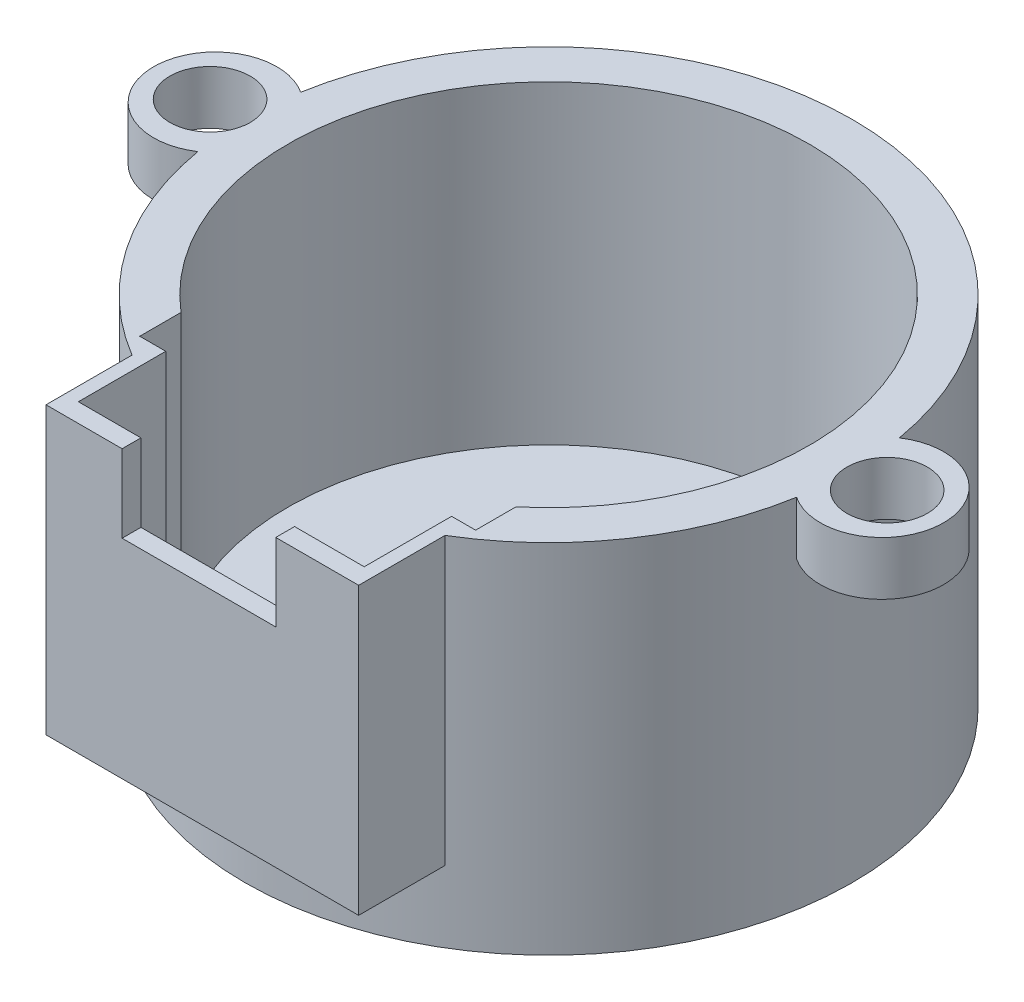
ISO-10303-21;
HEADER;
FILE_DESCRIPTION(('STEP AP214'),'2;1');
FILE_NAME('part.step','',(''),(''),'','','');
FILE_SCHEMA(('AUTOMOTIVE_DESIGN { 1 0 10303 214 1 1 1 1 }'));
ENDSEC;
DATA;
#1=APPLICATION_CONTEXT('core data for automotive mechanical design processes');
#2=APPLICATION_PROTOCOL_DEFINITION('international standard','automotive_design',2000,#1);
#3=PRODUCT_CONTEXT('',#1,'mechanical');
#4=PRODUCT('Part','Part','',(#3));
#5=PRODUCT_RELATED_PRODUCT_CATEGORY('part','',(#4));
#6=PRODUCT_DEFINITION_FORMATION('','',#4);
#7=PRODUCT_DEFINITION_CONTEXT('part definition',#1,'design');
#8=PRODUCT_DEFINITION('design','',#6,#7);
#9=PRODUCT_DEFINITION_SHAPE('','',#8);
#10=(LENGTH_UNIT() NAMED_UNIT(*) SI_UNIT(.MILLI.,.METRE.));
#11=(NAMED_UNIT(*) PLANE_ANGLE_UNIT() SI_UNIT($,.RADIAN.));
#12=(NAMED_UNIT(*) SI_UNIT($,.STERADIAN.) SOLID_ANGLE_UNIT());
#13=UNCERTAINTY_MEASURE_WITH_UNIT(LENGTH_MEASURE(1.E-05),#10,'distance_accuracy_value','');
#14=(GEOMETRIC_REPRESENTATION_CONTEXT(3) GLOBAL_UNCERTAINTY_ASSIGNED_CONTEXT((#13)) GLOBAL_UNIT_ASSIGNED_CONTEXT((#10,
#11,#12)) REPRESENTATION_CONTEXT('',''));
#15=CARTESIAN_POINT('',(0.,0.,0.));
#16=DIRECTION('',(0.,0.,1.));
#17=DIRECTION('',(1.,0.,0.));
#18=AXIS2_PLACEMENT_3D('',#15,#16,#17);
#19=CARTESIAN_POINT('',(0.,20.,0.));
#20=DIRECTION('',(0.,-1.,0.));
#21=DIRECTION('',(0.,0.,-1.));
#22=AXIS2_PLACEMENT_3D('',#19,#20,#21);
#23=CYLINDRICAL_SURFACE('',#22,17.);
#24=CARTESIAN_POINT('',(0.,4.,0.));
#25=DIRECTION('',(0.,1.,0.));
#26=DIRECTION('',(0.,0.,1.));
#27=AXIS2_PLACEMENT_3D('',#24,#25,#26);
#28=CIRCLE('',#27,17.);
#29=CARTESIAN_POINT('',(-8.7324203202721,4.,14.5857751028219));
#30=VERTEX_POINT('',#29);
#31=CARTESIAN_POINT('',(8.76757967972789,4.,14.5646677462832));
#32=VERTEX_POINT('',#31);
#33=EDGE_CURVE('E318',#30,#32,#28,.T.);
#34=ORIENTED_EDGE('',*,*,#33,.F.);
#35=DIRECTION('',(0.,-1.,0.));
#36=VECTOR('',#35,1.);
#37=CARTESIAN_POINT('',(-8.73242032027211,20.,14.5857751028219));
#38=LINE('',#37,#36);
#39=CARTESIAN_POINT('',(-8.73242032027211,20.,14.5857751028219));
#40=VERTEX_POINT('',#39);
#41=EDGE_CURVE('E399',#30,#40,#38,.F.);
#42=ORIENTED_EDGE('',*,*,#41,.T.);
#43=CARTESIAN_POINT('',(0.,20.,0.));
#44=DIRECTION('',(0.,1.,0.));
#45=DIRECTION('',(0.,0.,1.));
#46=AXIS2_PLACEMENT_3D('',#43,#44,#45);
#47=CIRCLE('',#46,17.);
#48=CARTESIAN_POINT('',(-16.7548421095073,20.,2.87667618710923));
#49=VERTEX_POINT('',#48);
#50=EDGE_CURVE('E254',#49,#40,#47,.T.);
#51=ORIENTED_EDGE('',*,*,#50,.F.);
#52=DIRECTION('',(0.,1.,0.));
#53=VECTOR('',#52,1.);
#54=CARTESIAN_POINT('',(-16.7548421095073,18.5,2.87667618710924));
#55=LINE('',#54,#53);
#56=CARTESIAN_POINT('',(-16.7548421095073,17.,2.87667618710924));
#57=VERTEX_POINT('',#56);
#58=EDGE_CURVE('E430',#49,#57,#55,.F.);
#59=ORIENTED_EDGE('',*,*,#58,.T.);
#60=CARTESIAN_POINT('',(0.,17.,0.));
#61=DIRECTION('',(0.,-1.,0.));
#62=DIRECTION('',(0.,0.,-1.));
#63=AXIS2_PLACEMENT_3D('',#60,#61,#62);
#64=CIRCLE('',#63,17.);
#65=CARTESIAN_POINT('',(-16.9667546174142,17.,1.06265598970331));
#66=VERTEX_POINT('',#65);
#67=EDGE_CURVE('E259',#57,#66,#64,.T.);
#68=ORIENTED_EDGE('',*,*,#67,.T.);
#69=CARTESIAN_POINT('',(-16.9667546174143,17.,-1.06265598970331));
#70=VERTEX_POINT('',#69);
#71=EDGE_CURVE('E263',#66,#70,#64,.T.);
#72=ORIENTED_EDGE('',*,*,#71,.T.);
#73=CARTESIAN_POINT('',(-16.7548421095073,17.,-2.87667618710924));
#74=VERTEX_POINT('',#73);
#75=EDGE_CURVE('E256',#70,#74,#64,.T.);
#76=ORIENTED_EDGE('',*,*,#75,.T.);
#77=DIRECTION('',(0.,1.,0.));
#78=VECTOR('',#77,1.);
#79=CARTESIAN_POINT('',(-16.7548421095073,18.5,-2.87667618710924));
#80=LINE('',#79,#78);
#81=CARTESIAN_POINT('',(-16.7548421095073,20.,-2.87667618710924));
#82=VERTEX_POINT('',#81);
#83=EDGE_CURVE('E250',#74,#82,#80,.T.);
#84=ORIENTED_EDGE('',*,*,#83,.T.);
#85=CARTESIAN_POINT('',(16.7548421095073,20.,-2.87667618710923));
#86=VERTEX_POINT('',#85);
#87=EDGE_CURVE('E247',#86,#82,#47,.T.);
#88=ORIENTED_EDGE('',*,*,#87,.F.);
#89=DIRECTION('',(0.,1.,0.));
#90=VECTOR('',#89,1.);
#91=CARTESIAN_POINT('',(16.7548421095073,18.5,-2.87667618710924));
#92=LINE('',#91,#90);
#93=CARTESIAN_POINT('',(16.7548421095073,17.,-2.87667618710924));
#94=VERTEX_POINT('',#93);
#95=EDGE_CURVE('E419',#86,#94,#92,.F.);
#96=ORIENTED_EDGE('',*,*,#95,.T.);
#97=CARTESIAN_POINT('',(0.,17.,0.));
#98=DIRECTION('',(0.,1.,0.));
#99=DIRECTION('',(0.,0.,1.));
#100=AXIS2_PLACEMENT_3D('',#97,#98,#99);
#101=CIRCLE('',#100,17.);
#102=CARTESIAN_POINT('',(16.9667546174142,17.,-1.06265598970332));
#103=VERTEX_POINT('',#102);
#104=EDGE_CURVE('E262',#103,#94,#101,.T.);
#105=ORIENTED_EDGE('',*,*,#104,.F.);
#106=CARTESIAN_POINT('',(16.9667546174143,17.,1.0626559897033));
#107=VERTEX_POINT('',#106);
#108=EDGE_CURVE('E268',#107,#103,#101,.T.);
#109=ORIENTED_EDGE('',*,*,#108,.F.);
#110=CARTESIAN_POINT('',(16.7548421095073,17.,2.87667618710924));
#111=VERTEX_POINT('',#110);
#112=EDGE_CURVE('E264',#111,#107,#101,.T.);
#113=ORIENTED_EDGE('',*,*,#112,.F.);
#114=DIRECTION('',(0.,1.,0.));
#115=VECTOR('',#114,1.);
#116=CARTESIAN_POINT('',(16.7548421095073,18.5,2.87667618710924));
#117=LINE('',#116,#115);
#118=CARTESIAN_POINT('',(16.7548421095073,20.,2.87667618710924));
#119=VERTEX_POINT('',#118);
#120=EDGE_CURVE('E423',#111,#119,#117,.T.);
#121=ORIENTED_EDGE('',*,*,#120,.T.);
#122=CARTESIAN_POINT('',(8.76757967972789,20.,14.5646677462832));
#123=VERTEX_POINT('',#122);
#124=EDGE_CURVE('E257',#123,#119,#47,.T.);
#125=ORIENTED_EDGE('',*,*,#124,.F.);
#126=DIRECTION('',(0.,-1.,0.));
#127=VECTOR('',#126,1.);
#128=CARTESIAN_POINT('',(8.76757967972789,20.,14.5646677462832));
#129=LINE('',#128,#127);
#130=EDGE_CURVE('E401',#123,#32,#129,.T.);
#131=ORIENTED_EDGE('',*,*,#130,.T.);
#132=EDGE_LOOP('',(#34,#42,#51,#59,#68,#72,#76,#84,#88,#96,#105,#109,#113,#121,#125,#131));
#133=FACE_BOUND('',#132,.T.);
#134=CARTESIAN_POINT('',(0.,0.,0.));
#135=DIRECTION('',(0.,1.,0.));
#136=DIRECTION('',(0.,0.,1.));
#137=AXIS2_PLACEMENT_3D('',#134,#135,#136);
#138=CIRCLE('',#137,17.);
#139=CARTESIAN_POINT('',(0.,0.,17.));
#140=VERTEX_POINT('',#139);
#141=EDGE_CURVE('E243',#140,#140,#138,.T.);
#142=ORIENTED_EDGE('',*,*,#141,.T.);
#143=EDGE_LOOP('',(#142));
#144=FACE_BOUND('',#143,.T.);
#145=ADVANCED_FACE('F37',(#133,#144),#23,.T.);
#146=CARTESIAN_POINT('',(0.,20.,0.));
#147=DIRECTION('',(0.,1.,0.));
#148=DIRECTION('',(0.,0.,1.));
#149=AXIS2_PLACEMENT_3D('',#146,#147,#148);
#150=PLANE('',#149);
#151=DIRECTION('',(0.,0.,1.));
#152=VECTOR('',#151,1.);
#153=CARTESIAN_POINT('',(-9.4317094190789,20.,13.4557980217237));
#154=LINE('',#153,#152);
#155=CARTESIAN_POINT('',(-9.4317094190789,20.,11.1446335710986));
#156=VERTEX_POINT('',#155);
#157=CARTESIAN_POINT('',(-9.4317094190789,20.,13.4557980217237));
#158=VERTEX_POINT('',#157);
#159=EDGE_CURVE('E208',#156,#158,#154,.T.);
#160=ORIENTED_EDGE('',*,*,#159,.F.);
#161=CARTESIAN_POINT('',(0.,20.,0.));
#162=DIRECTION('',(0.,1.,0.));
#163=DIRECTION('',(0.,0.,1.));
#164=AXIS2_PLACEMENT_3D('',#161,#162,#163);
#165=CIRCLE('',#164,14.6);
#166=CARTESIAN_POINT('',(9.3682905809211,20.,11.1979967668965));
#167=VERTEX_POINT('',#166);
#168=EDGE_CURVE('E238',#167,#156,#165,.T.);
#169=ORIENTED_EDGE('',*,*,#168,.F.);
#170=DIRECTION('',(0.,0.,-1.));
#171=VECTOR('',#170,1.);
#172=CARTESIAN_POINT('',(9.3682905809211,20.,13.4557980217237));
#173=LINE('',#172,#171);
#174=CARTESIAN_POINT('',(9.3682905809211,20.,13.4557980217237));
#175=VERTEX_POINT('',#174);
#176=EDGE_CURVE('E202',#175,#167,#173,.T.);
#177=ORIENTED_EDGE('',*,*,#176,.F.);
#178=DIRECTION('',(1.,0.,0.));
#179=VECTOR('',#178,1.);
#180=CARTESIAN_POINT('',(-9.4317094190789,20.,13.4557980217237));
#181=LINE('',#180,#179);
#182=CARTESIAN_POINT('',(8.02597753464213,20.,13.4557980217237));
#183=VERTEX_POINT('',#182);
#184=EDGE_CURVE('E227',#183,#175,#181,.T.);
#185=ORIENTED_EDGE('',*,*,#184,.F.);
#186=DIRECTION('',(0.,0.,-1.));
#187=VECTOR('',#186,1.);
#188=CARTESIAN_POINT('',(8.02597753464213,20.,18.3476478252229));
#189=LINE('',#188,#187);
#190=CARTESIAN_POINT('',(8.02597753464213,20.,18.3476478252229));
#191=VERTEX_POINT('',#190);
#192=EDGE_CURVE('E474',#191,#183,#189,.T.);
#193=ORIENTED_EDGE('',*,*,#192,.F.);
#194=DIRECTION('',(1.,0.,0.));
#195=VECTOR('',#194,1.);
#196=CARTESIAN_POINT('',(-7.97402246535787,20.,18.3476478252229));
#197=LINE('',#196,#195);
#198=CARTESIAN_POINT('',(4.1275125370491,20.,18.3476478252229));
#199=VERTEX_POINT('',#198);
#200=EDGE_CURVE('E480',#199,#191,#197,.T.);
#201=ORIENTED_EDGE('',*,*,#200,.F.);
#202=DIRECTION('',(0.,0.,-1.));
#203=VECTOR('',#202,1.);
#204=CARTESIAN_POINT('',(4.1275125370491,20.,0.));
#205=LINE('',#204,#203);
#206=CARTESIAN_POINT('',(4.1275125370491,20.,19.4006339721444));
#207=VERTEX_POINT('',#206);
#208=EDGE_CURVE('E490',#207,#199,#205,.T.);
#209=ORIENTED_EDGE('',*,*,#208,.F.);
#210=DIRECTION('',(1.,0.,0.));
#211=VECTOR('',#210,1.);
#212=CARTESIAN_POINT('',(-8.73242032027211,20.,19.4006339721444));
#213=LINE('',#212,#211);
#214=CARTESIAN_POINT('',(8.7675796797279,20.,19.4006339721444));
#215=VERTEX_POINT('',#214);
#216=EDGE_CURVE('E385',#207,#215,#213,.T.);
#217=ORIENTED_EDGE('',*,*,#216,.T.);
#218=DIRECTION('',(0.,0.,-1.));
#219=VECTOR('',#218,1.);
#220=CARTESIAN_POINT('',(8.76757967972789,20.,11.7006339721444));
#221=LINE('',#220,#219);
#222=EDGE_CURVE('E384',#215,#123,#221,.T.);
#223=ORIENTED_EDGE('',*,*,#222,.T.);
#224=ORIENTED_EDGE('',*,*,#124,.T.);
#225=CARTESIAN_POINT('',(18.6593720028192,20.,0.));
#226=DIRECTION('',(0.,1.,0.));
#227=DIRECTION('',(0.,0.,1.));
#228=AXIS2_PLACEMENT_3D('',#225,#226,#227);
#229=CIRCLE('',#228,3.45);
#230=EDGE_CURVE('E407',#119,#86,#229,.T.);
#231=ORIENTED_EDGE('',*,*,#230,.T.);
#232=ORIENTED_EDGE('',*,*,#87,.T.);
#233=CARTESIAN_POINT('',(-18.6593720028192,20.,0.));
#234=DIRECTION('',(0.,1.,0.));
#235=DIRECTION('',(0.,0.,-1.));
#236=AXIS2_PLACEMENT_3D('',#233,#234,#235);
#237=CIRCLE('',#236,3.45);
#238=EDGE_CURVE('E426',#82,#49,#237,.T.);
#239=ORIENTED_EDGE('',*,*,#238,.T.);
#240=ORIENTED_EDGE('',*,*,#50,.T.);
#241=DIRECTION('',(0.,0.,1.));
#242=VECTOR('',#241,1.);
#243=CARTESIAN_POINT('',(-8.73242032027211,20.,11.7006339721444));
#244=LINE('',#243,#242);
#245=CARTESIAN_POINT('',(-8.73242032027211,20.,19.4006339721444));
#246=VERTEX_POINT('',#245);
#247=EDGE_CURVE('E382',#40,#246,#244,.T.);
#248=ORIENTED_EDGE('',*,*,#247,.T.);
#249=CARTESIAN_POINT('',(-4.4724874629509,20.,19.4006339721444));
#250=VERTEX_POINT('',#249);
#251=EDGE_CURVE('E371',#246,#250,#213,.T.);
#252=ORIENTED_EDGE('',*,*,#251,.T.);
#253=DIRECTION('',(0.,0.,1.));
#254=VECTOR('',#253,1.);
#255=CARTESIAN_POINT('',(-4.4724874629509,20.,0.));
#256=LINE('',#255,#254);
#257=CARTESIAN_POINT('',(-4.4724874629509,20.,18.3476478252229));
#258=VERTEX_POINT('',#257);
#259=EDGE_CURVE('E380',#258,#250,#256,.T.);
#260=ORIENTED_EDGE('',*,*,#259,.F.);
#261=CARTESIAN_POINT('',(-7.97402246535787,20.,18.3476478252229));
#262=VERTEX_POINT('',#261);
#263=EDGE_CURVE('E478',#262,#258,#197,.T.);
#264=ORIENTED_EDGE('',*,*,#263,.F.);
#265=DIRECTION('',(0.,0.,1.));
#266=VECTOR('',#265,1.);
#267=CARTESIAN_POINT('',(-7.97402246535787,20.,18.3476478252229));
#268=LINE('',#267,#266);
#269=CARTESIAN_POINT('',(-7.97402246535787,20.,13.4557980217237));
#270=VERTEX_POINT('',#269);
#271=EDGE_CURVE('E481',#270,#262,#268,.T.);
#272=ORIENTED_EDGE('',*,*,#271,.F.);
#273=EDGE_CURVE('E504',#158,#270,#181,.T.);
#274=ORIENTED_EDGE('',*,*,#273,.F.);
#275=EDGE_LOOP('',(#160,#169,#177,#185,#193,#201,#209,#217,#223,#224,#231,#232,#239,#240,#248,
#252,#260,#264,#272,#274));
#276=FACE_BOUND('',#275,.T.);
#277=CARTESIAN_POINT('',(18.95,20.,0.));
#278=DIRECTION('',(0.,1.,0.));
#279=DIRECTION('',(0.,0.,1.));
#280=AXIS2_PLACEMENT_3D('',#277,#278,#279);
#281=CIRCLE('',#280,2.25);
#282=CARTESIAN_POINT('',(18.95,20.,2.24999999999999));
#283=VERTEX_POINT('',#282);
#284=EDGE_CURVE('E408',#283,#283,#281,.T.);
#285=ORIENTED_EDGE('',*,*,#284,.F.);
#286=EDGE_LOOP('',(#285));
#287=FACE_BOUND('',#286,.T.);
#288=CARTESIAN_POINT('',(-18.95,20.,0.));
#289=DIRECTION('',(0.,1.,0.));
#290=DIRECTION('',(0.,0.,-1.));
#291=AXIS2_PLACEMENT_3D('',#288,#289,#290);
#292=CIRCLE('',#291,2.25);
#293=CARTESIAN_POINT('',(-18.95,20.,-2.25));
#294=VERTEX_POINT('',#293);
#295=EDGE_CURVE('E403',#294,#294,#292,.T.);
#296=ORIENTED_EDGE('',*,*,#295,.F.);
#297=EDGE_LOOP('',(#296));
#298=FACE_BOUND('',#297,.T.);
#299=ADVANCED_FACE('F241',(#276,#287,#298),#150,.T.);
#300=CARTESIAN_POINT('',(0.,0.,0.));
#301=DIRECTION('',(0.,1.,0.));
#302=DIRECTION('',(0.,0.,1.));
#303=AXIS2_PLACEMENT_3D('',#300,#301,#302);
#304=PLANE('',#303);
#305=ORIENTED_EDGE('',*,*,#141,.F.);
#306=EDGE_LOOP('',(#305));
#307=FACE_BOUND('',#306,.T.);
#308=ADVANCED_FACE('F312',(#307),#304,.F.);
#309=CARTESIAN_POINT('',(0.,20.,0.));
#310=DIRECTION('',(0.,-1.,0.));
#311=DIRECTION('',(0.,0.,-1.));
#312=AXIS2_PLACEMENT_3D('',#309,#310,#311);
#313=CYLINDRICAL_SURFACE('',#312,14.6);
#314=DIRECTION('',(0.,-1.,0.));
#315=VECTOR('',#314,1.);
#316=CARTESIAN_POINT('',(9.3682905809211,20.,11.1979967668965));
#317=LINE('',#316,#315);
#318=CARTESIAN_POINT('',(9.3682905809211,4.,11.1979967668965));
#319=VERTEX_POINT('',#318);
#320=EDGE_CURVE('E11',#167,#319,#317,.T.);
#321=ORIENTED_EDGE('',*,*,#320,.F.);
#322=ORIENTED_EDGE('',*,*,#168,.T.);
#323=DIRECTION('',(0.,-1.,0.));
#324=VECTOR('',#323,1.);
#325=CARTESIAN_POINT('',(-9.4317094190789,20.,11.1446335710986));
#326=LINE('',#325,#324);
#327=CARTESIAN_POINT('',(-9.4317094190789,4.,11.1446335710986));
#328=VERTEX_POINT('',#327);
#329=EDGE_CURVE('E44',#328,#156,#326,.F.);
#330=ORIENTED_EDGE('',*,*,#329,.F.);
#331=CARTESIAN_POINT('',(0.,4.,0.));
#332=DIRECTION('',(0.,1.,0.));
#333=DIRECTION('',(0.,0.,1.));
#334=AXIS2_PLACEMENT_3D('',#331,#332,#333);
#335=CIRCLE('',#334,14.6);
#336=CARTESIAN_POINT('',(-5.66581852856031,4.,13.4557980217237));
#337=VERTEX_POINT('',#336);
#338=EDGE_CURVE('E198',#328,#337,#335,.T.);
#339=ORIENTED_EDGE('',*,*,#338,.T.);
#340=CARTESIAN_POINT('',(5.66581852856031,4.,13.4557980217237));
#341=VERTEX_POINT('',#340);
#342=EDGE_CURVE('E273',#337,#341,#335,.T.);
#343=ORIENTED_EDGE('',*,*,#342,.T.);
#344=CARTESIAN_POINT('',(0.,4.,0.));
#345=DIRECTION('',(0.,-1.,0.));
#346=DIRECTION('',(0.,0.,-1.));
#347=AXIS2_PLACEMENT_3D('',#344,#345,#346);
#348=CIRCLE('',#347,14.6);
#349=EDGE_CURVE('E224',#319,#341,#348,.T.);
#350=ORIENTED_EDGE('',*,*,#349,.F.);
#351=EDGE_LOOP('',(#321,#322,#330,#339,#343,#350));
#352=FACE_BOUND('',#351,.T.);
#353=CARTESIAN_POINT('',(0.,2.4,0.));
#354=DIRECTION('',(0.,1.,0.));
#355=DIRECTION('',(0.,0.,1.));
#356=AXIS2_PLACEMENT_3D('',#353,#354,#355);
#357=CIRCLE('',#356,14.6);
#358=CARTESIAN_POINT('',(0.,2.4,14.6));
#359=VERTEX_POINT('',#358);
#360=EDGE_CURVE('E244',#359,#359,#357,.T.);
#361=ORIENTED_EDGE('',*,*,#360,.F.);
#362=EDGE_LOOP('',(#361));
#363=FACE_BOUND('',#362,.T.);
#364=ADVANCED_FACE('F236',(#352,#363),#313,.F.);
#365=CARTESIAN_POINT('',(0.,2.4,0.));
#366=DIRECTION('',(0.,1.,0.));
#367=DIRECTION('',(0.,0.,1.));
#368=AXIS2_PLACEMENT_3D('',#365,#366,#367);
#369=PLANE('',#368);
#370=ORIENTED_EDGE('',*,*,#360,.T.);
#371=EDGE_LOOP('',(#370));
#372=FACE_BOUND('',#371,.T.);
#373=ADVANCED_FACE('F325',(#372),#369,.T.);
#374=CARTESIAN_POINT('',(-18.6593720028192,17.,0.));
#375=DIRECTION('',(0.,1.,0.));
#376=DIRECTION('',(0.,0.,1.));
#377=AXIS2_PLACEMENT_3D('',#374,#375,#376);
#378=CYLINDRICAL_SURFACE('',#377,3.45);
#379=ORIENTED_EDGE('',*,*,#83,.F.);
#380=CARTESIAN_POINT('',(-18.6593720028192,17.,0.));
#381=DIRECTION('',(0.,1.,0.));
#382=DIRECTION('',(0.,0.,-1.));
#383=AXIS2_PLACEMENT_3D('',#380,#381,#382);
#384=CIRCLE('',#383,3.45);
#385=EDGE_CURVE('E427',#74,#57,#384,.T.);
#386=ORIENTED_EDGE('',*,*,#385,.T.);
#387=ORIENTED_EDGE('',*,*,#58,.F.);
#388=ORIENTED_EDGE('',*,*,#238,.F.);
#389=EDGE_LOOP('',(#379,#386,#387,#388));
#390=FACE_BOUND('',#389,.T.);
#391=ADVANCED_FACE('F329',(#390),#378,.T.);
#392=CARTESIAN_POINT('',(-18.6593720028192,17.,0.));
#393=DIRECTION('',(0.,-1.,0.));
#394=DIRECTION('',(0.,0.,-1.));
#395=AXIS2_PLACEMENT_3D('',#392,#393,#394);
#396=PLANE('',#395);
#397=CARTESIAN_POINT('',(-18.95,17.,0.));
#398=DIRECTION('',(0.,-1.,0.));
#399=DIRECTION('',(0.,0.,-1.));
#400=AXIS2_PLACEMENT_3D('',#397,#398,#399);
#401=CIRCLE('',#400,2.25);
#402=EDGE_CURVE('E271',#66,#70,#401,.T.);
#403=ORIENTED_EDGE('',*,*,#402,.F.);
#404=ORIENTED_EDGE('',*,*,#67,.F.);
#405=ORIENTED_EDGE('',*,*,#385,.F.);
#406=ORIENTED_EDGE('',*,*,#75,.F.);
#407=EDGE_LOOP('',(#403,#404,#405,#406));
#408=FACE_BOUND('',#407,.T.);
#409=ADVANCED_FACE('F334',(#408),#396,.T.);
#410=CARTESIAN_POINT('',(18.6593720028192,17.,0.));
#411=DIRECTION('',(0.,1.,0.));
#412=DIRECTION('',(0.,0.,1.));
#413=AXIS2_PLACEMENT_3D('',#410,#411,#412);
#414=CYLINDRICAL_SURFACE('',#413,3.45);
#415=ORIENTED_EDGE('',*,*,#120,.F.);
#416=CARTESIAN_POINT('',(18.6593720028192,17.,0.));
#417=DIRECTION('',(0.,1.,0.));
#418=DIRECTION('',(0.,0.,1.));
#419=AXIS2_PLACEMENT_3D('',#416,#417,#418);
#420=CIRCLE('',#419,3.45);
#421=EDGE_CURVE('E416',#111,#94,#420,.T.);
#422=ORIENTED_EDGE('',*,*,#421,.T.);
#423=ORIENTED_EDGE('',*,*,#95,.F.);
#424=ORIENTED_EDGE('',*,*,#230,.F.);
#425=EDGE_LOOP('',(#415,#422,#423,#424));
#426=FACE_BOUND('',#425,.T.);
#427=ADVANCED_FACE('F338',(#426),#414,.T.);
#428=CARTESIAN_POINT('',(18.6593720028192,17.,0.));
#429=DIRECTION('',(0.,1.,0.));
#430=DIRECTION('',(0.,0.,1.));
#431=AXIS2_PLACEMENT_3D('',#428,#429,#430);
#432=PLANE('',#431);
#433=ORIENTED_EDGE('',*,*,#112,.T.);
#434=CARTESIAN_POINT('',(18.95,17.,0.));
#435=DIRECTION('',(0.,1.,0.));
#436=DIRECTION('',(0.,0.,1.));
#437=AXIS2_PLACEMENT_3D('',#434,#435,#436);
#438=CIRCLE('',#437,2.25);
#439=EDGE_CURVE('E267',#107,#103,#438,.T.);
#440=ORIENTED_EDGE('',*,*,#439,.T.);
#441=ORIENTED_EDGE('',*,*,#104,.T.);
#442=ORIENTED_EDGE('',*,*,#421,.F.);
#443=EDGE_LOOP('',(#433,#440,#441,#442));
#444=FACE_BOUND('',#443,.T.);
#445=ADVANCED_FACE('F342',(#444),#432,.F.);
#446=CARTESIAN_POINT('',(18.95,17.,0.));
#447=DIRECTION('',(0.,1.,0.));
#448=DIRECTION('',(0.,0.,1.));
#449=AXIS2_PLACEMENT_3D('',#446,#447,#448);
#450=PLANE('',#449);
#451=ORIENTED_EDGE('',*,*,#108,.T.);
#452=CARTESIAN_POINT('',(18.95,17.,0.));
#453=DIRECTION('',(0.,1.,0.));
#454=DIRECTION('',(0.,0.,1.));
#455=AXIS2_PLACEMENT_3D('',#452,#453,#454);
#456=CIRCLE('',#455,2.25);
#457=EDGE_CURVE('E404',#103,#107,#456,.T.);
#458=ORIENTED_EDGE('',*,*,#457,.T.);
#459=EDGE_LOOP('',(#451,#458));
#460=FACE_BOUND('',#459,.T.);
#461=ADVANCED_FACE('F345',(#460),#450,.T.);
#462=CARTESIAN_POINT('',(18.95,17.,0.));
#463=DIRECTION('',(0.,1.,0.));
#464=DIRECTION('',(0.,0.,1.));
#465=AXIS2_PLACEMENT_3D('',#462,#463,#464);
#466=CYLINDRICAL_SURFACE('',#465,2.25);
#467=ORIENTED_EDGE('',*,*,#457,.F.);
#468=ORIENTED_EDGE('',*,*,#439,.F.);
#469=EDGE_LOOP('',(#467,#468));
#470=FACE_BOUND('',#469,.T.);
#471=ORIENTED_EDGE('',*,*,#284,.T.);
#472=EDGE_LOOP('',(#471));
#473=FACE_BOUND('',#472,.T.);
#474=ADVANCED_FACE('F350',(#470,#473),#466,.F.);
#475=CARTESIAN_POINT('',(-18.95,17.,0.));
#476=DIRECTION('',(0.,-1.,0.));
#477=DIRECTION('',(0.,0.,-1.));
#478=AXIS2_PLACEMENT_3D('',#475,#476,#477);
#479=PLANE('',#478);
#480=CARTESIAN_POINT('',(-18.95,17.,0.));
#481=DIRECTION('',(0.,1.,0.));
#482=DIRECTION('',(0.,0.,-1.));
#483=AXIS2_PLACEMENT_3D('',#480,#481,#482);
#484=CIRCLE('',#483,2.25);
#485=EDGE_CURVE('E411',#66,#70,#484,.T.);
#486=ORIENTED_EDGE('',*,*,#485,.T.);
#487=ORIENTED_EDGE('',*,*,#71,.F.);
#488=EDGE_LOOP('',(#486,#487));
#489=FACE_BOUND('',#488,.T.);
#490=ADVANCED_FACE('F299',(#489),#479,.F.);
#491=CARTESIAN_POINT('',(-18.95,17.,0.));
#492=DIRECTION('',(0.,1.,0.));
#493=DIRECTION('',(0.,0.,1.));
#494=AXIS2_PLACEMENT_3D('',#491,#492,#493);
#495=CYLINDRICAL_SURFACE('',#494,2.25);
#496=ORIENTED_EDGE('',*,*,#485,.F.);
#497=ORIENTED_EDGE('',*,*,#402,.T.);
#498=EDGE_LOOP('',(#496,#497));
#499=FACE_BOUND('',#498,.T.);
#500=ORIENTED_EDGE('',*,*,#295,.T.);
#501=EDGE_LOOP('',(#500));
#502=FACE_BOUND('',#501,.T.);
#503=ADVANCED_FACE('F289',(#499,#502),#495,.F.);
#504=CARTESIAN_POINT('',(0.,4.,0.));
#505=DIRECTION('',(0.,1.,0.));
#506=DIRECTION('',(0.,0.,1.));
#507=AXIS2_PLACEMENT_3D('',#504,#505,#506);
#508=PLANE('',#507);
#509=ORIENTED_EDGE('',*,*,#342,.F.);
#510=DIRECTION('',(1.,0.,0.));
#511=VECTOR('',#510,1.);
#512=CARTESIAN_POINT('',(-9.4317094190789,4.,13.4557980217237));
#513=LINE('',#512,#511);
#514=EDGE_CURVE('E216',#337,#341,#513,.T.);
#515=ORIENTED_EDGE('',*,*,#514,.T.);
#516=EDGE_LOOP('',(#509,#515));
#517=FACE_BOUND('',#516,.T.);
#518=ADVANCED_FACE('F286',(#517),#508,.F.);
#519=CARTESIAN_POINT('',(8.76757967972789,4.,11.7006339721444));
#520=DIRECTION('',(1.,0.,0.));
#521=DIRECTION('',(0.,0.,-1.));
#522=AXIS2_PLACEMENT_3D('',#519,#520,#521);
#523=PLANE('',#522);
#524=ORIENTED_EDGE('',*,*,#130,.F.);
#525=ORIENTED_EDGE('',*,*,#222,.F.);
#526=DIRECTION('',(0.,1.,0.));
#527=VECTOR('',#526,1.);
#528=CARTESIAN_POINT('',(8.7675796797279,4.,19.4006339721444));
#529=LINE('',#528,#527);
#530=CARTESIAN_POINT('',(8.7675796797279,4.,19.4006339721444));
#531=VERTEX_POINT('',#530);
#532=EDGE_CURVE('E392',#531,#215,#529,.T.);
#533=ORIENTED_EDGE('',*,*,#532,.F.);
#534=DIRECTION('',(0.,0.,-1.));
#535=VECTOR('',#534,1.);
#536=CARTESIAN_POINT('',(8.76757967972789,4.,11.7006339721444));
#537=LINE('',#536,#535);
#538=EDGE_CURVE('E397',#531,#32,#537,.T.);
#539=ORIENTED_EDGE('',*,*,#538,.T.);
#540=EDGE_LOOP('',(#524,#525,#533,#539));
#541=FACE_BOUND('',#540,.T.);
#542=ADVANCED_FACE('F288',(#541),#523,.T.);
#543=CARTESIAN_POINT('',(-8.73242032027211,4.,11.7006339721444));
#544=DIRECTION('',(-1.,0.,0.));
#545=DIRECTION('',(0.,0.,1.));
#546=AXIS2_PLACEMENT_3D('',#543,#544,#545);
#547=PLANE('',#546);
#548=ORIENTED_EDGE('',*,*,#41,.F.);
#549=DIRECTION('',(0.,0.,1.));
#550=VECTOR('',#549,1.);
#551=CARTESIAN_POINT('',(-8.73242032027211,4.,11.7006339721444));
#552=LINE('',#551,#550);
#553=CARTESIAN_POINT('',(-8.73242032027211,4.,19.4006339721444));
#554=VERTEX_POINT('',#553);
#555=EDGE_CURVE('E387',#30,#554,#552,.T.);
#556=ORIENTED_EDGE('',*,*,#555,.T.);
#557=DIRECTION('',(0.,1.,0.));
#558=VECTOR('',#557,1.);
#559=CARTESIAN_POINT('',(-8.73242032027211,4.,19.4006339721444));
#560=LINE('',#559,#558);
#561=EDGE_CURVE('E395',#554,#246,#560,.T.);
#562=ORIENTED_EDGE('',*,*,#561,.T.);
#563=ORIENTED_EDGE('',*,*,#247,.F.);
#564=EDGE_LOOP('',(#548,#556,#562,#563));
#565=FACE_BOUND('',#564,.T.);
#566=ADVANCED_FACE('F296',(#565),#547,.T.);
#567=CARTESIAN_POINT('',(-8.73242032027211,4.,19.4006339721444));
#568=DIRECTION('',(0.,0.,1.));
#569=DIRECTION('',(1.,0.,0.));
#570=AXIS2_PLACEMENT_3D('',#567,#568,#569);
#571=PLANE('',#570);
#572=DIRECTION('',(0.,-1.,0.));
#573=VECTOR('',#572,1.);
#574=CARTESIAN_POINT('',(-4.4724874629509,15.6609971684918,19.4006339721444));
#575=LINE('',#574,#573);
#576=CARTESIAN_POINT('',(-4.4724874629509,15.6609971684918,19.4006339721444));
#577=VERTEX_POINT('',#576);
#578=EDGE_CURVE('E368',#250,#577,#575,.T.);
#579=ORIENTED_EDGE('',*,*,#578,.F.);
#580=ORIENTED_EDGE('',*,*,#251,.F.);
#581=ORIENTED_EDGE('',*,*,#561,.F.);
#582=DIRECTION('',(1.,0.,0.));
#583=VECTOR('',#582,1.);
#584=CARTESIAN_POINT('',(-8.73242032027211,4.,19.4006339721444));
#585=LINE('',#584,#583);
#586=EDGE_CURVE('E463',#554,#531,#585,.T.);
#587=ORIENTED_EDGE('',*,*,#586,.T.);
#588=ORIENTED_EDGE('',*,*,#532,.T.);
#589=ORIENTED_EDGE('',*,*,#216,.F.);
#590=DIRECTION('',(0.,1.,0.));
#591=VECTOR('',#590,1.);
#592=CARTESIAN_POINT('',(4.1275125370491,15.6609971684918,19.4006339721444));
#593=LINE('',#592,#591);
#594=CARTESIAN_POINT('',(4.1275125370491,15.6609971684918,19.4006339721444));
#595=VERTEX_POINT('',#594);
#596=EDGE_CURVE('E494',#595,#207,#593,.T.);
#597=ORIENTED_EDGE('',*,*,#596,.F.);
#598=DIRECTION('',(1.,0.,0.));
#599=VECTOR('',#598,1.);
#600=CARTESIAN_POINT('',(-4.4724874629509,15.6609971684918,19.4006339721444));
#601=LINE('',#600,#599);
#602=EDGE_CURVE('E373',#577,#595,#601,.T.);
#603=ORIENTED_EDGE('',*,*,#602,.F.);
#604=EDGE_LOOP('',(#579,#580,#581,#587,#588,#589,#597,#603));
#605=FACE_BOUND('',#604,.T.);
#606=ADVANCED_FACE('F305',(#605),#571,.T.);
#607=ORIENTED_EDGE('',*,*,#555,.F.);
#608=ORIENTED_EDGE('',*,*,#33,.T.);
#609=ORIENTED_EDGE('',*,*,#538,.F.);
#610=ORIENTED_EDGE('',*,*,#586,.F.);
#611=EDGE_LOOP('',(#607,#608,#609,#610));
#612=FACE_BOUND('',#611,.T.);
#613=ADVANCED_FACE('F291',(#612),#508,.F.);
#614=CARTESIAN_POINT('',(-7.97402246535787,6.,18.3476478252229));
#615=DIRECTION('',(-1.,0.,0.));
#616=DIRECTION('',(0.,0.,1.));
#617=AXIS2_PLACEMENT_3D('',#614,#615,#616);
#618=PLANE('',#617);
#619=DIRECTION('',(0.,0.,1.));
#620=VECTOR('',#619,1.);
#621=CARTESIAN_POINT('',(-7.97402246535787,6.,18.3476478252229));
#622=LINE('',#621,#620);
#623=CARTESIAN_POINT('',(-7.97402246535787,6.,13.4557980217237));
#624=VERTEX_POINT('',#623);
#625=CARTESIAN_POINT('',(-7.97402246535787,6.,18.3476478252229));
#626=VERTEX_POINT('',#625);
#627=EDGE_CURVE('E477',#624,#626,#622,.T.);
#628=ORIENTED_EDGE('',*,*,#627,.F.);
#629=DIRECTION('',(0.,1.,0.));
#630=VECTOR('',#629,1.);
#631=CARTESIAN_POINT('',(-7.97402246535787,6.,13.4557980217237));
#632=LINE('',#631,#630);
#633=EDGE_CURVE('E51',#624,#270,#632,.T.);
#634=ORIENTED_EDGE('',*,*,#633,.T.);
#635=ORIENTED_EDGE('',*,*,#271,.T.);
#636=DIRECTION('',(0.,1.,0.));
#637=VECTOR('',#636,1.);
#638=CARTESIAN_POINT('',(-7.97402246535787,6.,18.3476478252229));
#639=LINE('',#638,#637);
#640=EDGE_CURVE('E467',#626,#262,#639,.T.);
#641=ORIENTED_EDGE('',*,*,#640,.F.);
#642=EDGE_LOOP('',(#628,#634,#635,#641));
#643=FACE_BOUND('',#642,.T.);
#644=ADVANCED_FACE('F304',(#643),#618,.F.);
#645=CARTESIAN_POINT('',(8.02597753464213,6.,18.3476478252229));
#646=DIRECTION('',(1.,0.,0.));
#647=DIRECTION('',(0.,0.,-1.));
#648=AXIS2_PLACEMENT_3D('',#645,#646,#647);
#649=PLANE('',#648);
#650=ORIENTED_EDGE('',*,*,#192,.T.);
#651=DIRECTION('',(0.,-1.,0.));
#652=VECTOR('',#651,1.);
#653=CARTESIAN_POINT('',(8.02597753464213,6.,13.4557980217237));
#654=LINE('',#653,#652);
#655=CARTESIAN_POINT('',(8.02597753464213,6.,13.4557980217237));
#656=VERTEX_POINT('',#655);
#657=EDGE_CURVE('E499',#183,#656,#654,.T.);
#658=ORIENTED_EDGE('',*,*,#657,.T.);
#659=DIRECTION('',(0.,0.,-1.));
#660=VECTOR('',#659,1.);
#661=CARTESIAN_POINT('',(8.02597753464213,6.,18.3476478252229));
#662=LINE('',#661,#660);
#663=CARTESIAN_POINT('',(8.02597753464213,6.,18.3476478252229));
#664=VERTEX_POINT('',#663);
#665=EDGE_CURVE('E471',#664,#656,#662,.T.);
#666=ORIENTED_EDGE('',*,*,#665,.F.);
#667=DIRECTION('',(0.,1.,0.));
#668=VECTOR('',#667,1.);
#669=CARTESIAN_POINT('',(8.02597753464213,6.,18.3476478252229));
#670=LINE('',#669,#668);
#671=EDGE_CURVE('E470',#664,#191,#670,.T.);
#672=ORIENTED_EDGE('',*,*,#671,.T.);
#673=EDGE_LOOP('',(#650,#658,#666,#672));
#674=FACE_BOUND('',#673,.T.);
#675=ADVANCED_FACE('F517',(#674),#649,.F.);
#676=CARTESIAN_POINT('',(-7.97402246535787,6.,18.3476478252229));
#677=DIRECTION('',(0.,0.,1.));
#678=DIRECTION('',(1.,0.,0.));
#679=AXIS2_PLACEMENT_3D('',#676,#677,#678);
#680=PLANE('',#679);
#681=ORIENTED_EDGE('',*,*,#263,.T.);
#682=DIRECTION('',(0.,-1.,0.));
#683=VECTOR('',#682,1.);
#684=CARTESIAN_POINT('',(-4.4724874629509,6.,18.3476478252229));
#685=LINE('',#684,#683);
#686=CARTESIAN_POINT('',(-4.4724874629509,15.6609971684918,18.3476478252229));
#687=VERTEX_POINT('',#686);
#688=EDGE_CURVE('E281',#258,#687,#685,.T.);
#689=ORIENTED_EDGE('',*,*,#688,.T.);
#690=DIRECTION('',(1.,0.,0.));
#691=VECTOR('',#690,1.);
#692=CARTESIAN_POINT('',(-7.97402246535787,15.6609971684918,18.3476478252229));
#693=LINE('',#692,#691);
#694=CARTESIAN_POINT('',(4.1275125370491,15.6609971684918,18.3476478252229));
#695=VERTEX_POINT('',#694);
#696=EDGE_CURVE('E275',#687,#695,#693,.T.);
#697=ORIENTED_EDGE('',*,*,#696,.T.);
#698=DIRECTION('',(0.,1.,0.));
#699=VECTOR('',#698,1.);
#700=CARTESIAN_POINT('',(4.1275125370491,6.,18.3476478252229));
#701=LINE('',#700,#699);
#702=EDGE_CURVE('E278',#695,#199,#701,.T.);
#703=ORIENTED_EDGE('',*,*,#702,.T.);
#704=ORIENTED_EDGE('',*,*,#200,.T.);
#705=ORIENTED_EDGE('',*,*,#671,.F.);
#706=DIRECTION('',(1.,0.,0.));
#707=VECTOR('',#706,1.);
#708=CARTESIAN_POINT('',(-7.97402246535787,6.,18.3476478252229));
#709=LINE('',#708,#707);
#710=EDGE_CURVE('E485',#626,#664,#709,.T.);
#711=ORIENTED_EDGE('',*,*,#710,.F.);
#712=ORIENTED_EDGE('',*,*,#640,.T.);
#713=EDGE_LOOP('',(#681,#689,#697,#703,#704,#705,#711,#712));
#714=FACE_BOUND('',#713,.T.);
#715=ADVANCED_FACE('F511',(#714),#680,.F.);
#716=CARTESIAN_POINT('',(0.,6.,0.));
#717=DIRECTION('',(0.,-1.,0.));
#718=DIRECTION('',(0.,0.,-1.));
#719=AXIS2_PLACEMENT_3D('',#716,#717,#718);
#720=PLANE('',#719);
#721=ORIENTED_EDGE('',*,*,#665,.T.);
#722=DIRECTION('',(-1.,0.,0.));
#723=VECTOR('',#722,1.);
#724=CARTESIAN_POINT('',(0.,6.,13.4557980217237));
#725=LINE('',#724,#723);
#726=EDGE_CURVE('E284',#656,#624,#725,.T.);
#727=ORIENTED_EDGE('',*,*,#726,.T.);
#728=ORIENTED_EDGE('',*,*,#627,.T.);
#729=ORIENTED_EDGE('',*,*,#710,.T.);
#730=EDGE_LOOP('',(#721,#727,#728,#729));
#731=FACE_BOUND('',#730,.T.);
#732=ADVANCED_FACE('F515',(#731),#720,.F.);
#733=CARTESIAN_POINT('',(-4.4724874629509,15.6609971684918,14.4006339721444));
#734=DIRECTION('',(0.,-1.,0.));
#735=DIRECTION('',(0.,0.,-1.));
#736=AXIS2_PLACEMENT_3D('',#733,#734,#735);
#737=PLANE('',#736);
#738=DIRECTION('',(0.,0.,1.));
#739=VECTOR('',#738,1.);
#740=CARTESIAN_POINT('',(-4.4724874629509,15.6609971684918,14.4006339721444));
#741=LINE('',#740,#739);
#742=EDGE_CURVE('E492',#687,#577,#741,.T.);
#743=ORIENTED_EDGE('',*,*,#742,.T.);
#744=ORIENTED_EDGE('',*,*,#602,.T.);
#745=DIRECTION('',(0.,0.,1.));
#746=VECTOR('',#745,1.);
#747=CARTESIAN_POINT('',(4.1275125370491,15.6609971684918,14.4006339721444));
#748=LINE('',#747,#746);
#749=EDGE_CURVE('E59',#695,#595,#748,.T.);
#750=ORIENTED_EDGE('',*,*,#749,.F.);
#751=ORIENTED_EDGE('',*,*,#696,.F.);
#752=EDGE_LOOP('',(#743,#744,#750,#751));
#753=FACE_BOUND('',#752,.T.);
#754=ADVANCED_FACE('F525',(#753),#737,.F.);
#755=CARTESIAN_POINT('',(-4.4724874629509,15.6609971684918,14.4006339721444));
#756=DIRECTION('',(-1.,0.,0.));
#757=DIRECTION('',(0.,0.,1.));
#758=AXIS2_PLACEMENT_3D('',#755,#756,#757);
#759=PLANE('',#758);
#760=ORIENTED_EDGE('',*,*,#259,.T.);
#761=ORIENTED_EDGE('',*,*,#578,.T.);
#762=ORIENTED_EDGE('',*,*,#742,.F.);
#763=ORIENTED_EDGE('',*,*,#688,.F.);
#764=EDGE_LOOP('',(#760,#761,#762,#763));
#765=FACE_BOUND('',#764,.T.);
#766=ADVANCED_FACE('F526',(#765),#759,.F.);
#767=CARTESIAN_POINT('',(4.1275125370491,15.6609971684918,14.4006339721444));
#768=DIRECTION('',(1.,0.,0.));
#769=DIRECTION('',(0.,0.,-1.));
#770=AXIS2_PLACEMENT_3D('',#767,#768,#769);
#771=PLANE('',#770);
#772=ORIENTED_EDGE('',*,*,#208,.T.);
#773=ORIENTED_EDGE('',*,*,#702,.F.);
#774=ORIENTED_EDGE('',*,*,#749,.T.);
#775=ORIENTED_EDGE('',*,*,#596,.T.);
#776=EDGE_LOOP('',(#772,#773,#774,#775));
#777=FACE_BOUND('',#776,.T.);
#778=ADVANCED_FACE('F523',(#777),#771,.F.);
#779=CARTESIAN_POINT('',(-9.4317094190789,4.,13.4557980217237));
#780=DIRECTION('',(0.,0.,1.));
#781=DIRECTION('',(1.,0.,0.));
#782=AXIS2_PLACEMENT_3D('',#779,#780,#781);
#783=PLANE('',#782);
#784=ORIENTED_EDGE('',*,*,#726,.F.);
#785=ORIENTED_EDGE('',*,*,#657,.F.);
#786=ORIENTED_EDGE('',*,*,#184,.T.);
#787=DIRECTION('',(0.,1.,0.));
#788=VECTOR('',#787,1.);
#789=CARTESIAN_POINT('',(9.3682905809211,4.,13.4557980217237));
#790=LINE('',#789,#788);
#791=CARTESIAN_POINT('',(9.3682905809211,4.,13.4557980217237));
#792=VERTEX_POINT('',#791);
#793=EDGE_CURVE('E210',#792,#175,#790,.T.);
#794=ORIENTED_EDGE('',*,*,#793,.F.);
#795=EDGE_CURVE('E201',#341,#792,#513,.T.);
#796=ORIENTED_EDGE('',*,*,#795,.F.);
#797=ORIENTED_EDGE('',*,*,#514,.F.);
#798=CARTESIAN_POINT('',(-9.4317094190789,4.,13.4557980217237));
#799=VERTEX_POINT('',#798);
#800=EDGE_CURVE('E195',#799,#337,#513,.T.);
#801=ORIENTED_EDGE('',*,*,#800,.F.);
#802=DIRECTION('',(0.,1.,0.));
#803=VECTOR('',#802,1.);
#804=CARTESIAN_POINT('',(-9.4317094190789,4.,13.4557980217237));
#805=LINE('',#804,#803);
#806=EDGE_CURVE('E205',#799,#158,#805,.T.);
#807=ORIENTED_EDGE('',*,*,#806,.T.);
#808=ORIENTED_EDGE('',*,*,#273,.T.);
#809=ORIENTED_EDGE('',*,*,#633,.F.);
#810=EDGE_LOOP('',(#784,#785,#786,#794,#796,#797,#801,#807,#808,#809));
#811=FACE_BOUND('',#810,.T.);
#812=ADVANCED_FACE('F213',(#811),#783,.F.);
#813=CARTESIAN_POINT('',(0.,4.,0.));
#814=DIRECTION('',(0.,-1.,0.));
#815=DIRECTION('',(0.,0.,-1.));
#816=AXIS2_PLACEMENT_3D('',#813,#814,#815);
#817=PLANE('',#816);
#818=ORIENTED_EDGE('',*,*,#349,.T.);
#819=ORIENTED_EDGE('',*,*,#795,.T.);
#820=DIRECTION('',(0.,0.,-1.));
#821=VECTOR('',#820,1.);
#822=CARTESIAN_POINT('',(9.3682905809211,4.,13.4557980217237));
#823=LINE('',#822,#821);
#824=EDGE_CURVE('E211',#792,#319,#823,.T.);
#825=ORIENTED_EDGE('',*,*,#824,.T.);
#826=EDGE_LOOP('',(#818,#819,#825));
#827=FACE_BOUND('',#826,.T.);
#828=ADVANCED_FACE('F222',(#827),#817,.F.);
#829=CARTESIAN_POINT('',(-9.4317094190789,4.,13.4557980217237));
#830=DIRECTION('',(-1.,0.,0.));
#831=DIRECTION('',(0.,0.,1.));
#832=AXIS2_PLACEMENT_3D('',#829,#830,#831);
#833=PLANE('',#832);
#834=ORIENTED_EDGE('',*,*,#329,.T.);
#835=ORIENTED_EDGE('',*,*,#159,.T.);
#836=ORIENTED_EDGE('',*,*,#806,.F.);
#837=DIRECTION('',(0.,0.,1.));
#838=VECTOR('',#837,1.);
#839=CARTESIAN_POINT('',(-9.4317094190789,4.,13.4557980217237));
#840=LINE('',#839,#838);
#841=EDGE_CURVE('E191',#328,#799,#840,.T.);
#842=ORIENTED_EDGE('',*,*,#841,.F.);
#843=EDGE_LOOP('',(#834,#835,#836,#842));
#844=FACE_BOUND('',#843,.T.);
#845=ADVANCED_FACE('F206',(#844),#833,.F.);
#846=CARTESIAN_POINT('',(9.3682905809211,4.,13.4557980217237));
#847=DIRECTION('',(1.,0.,0.));
#848=DIRECTION('',(0.,0.,-1.));
#849=AXIS2_PLACEMENT_3D('',#846,#847,#848);
#850=PLANE('',#849);
#851=ORIENTED_EDGE('',*,*,#320,.T.);
#852=ORIENTED_EDGE('',*,*,#824,.F.);
#853=ORIENTED_EDGE('',*,*,#793,.T.);
#854=ORIENTED_EDGE('',*,*,#176,.T.);
#855=EDGE_LOOP('',(#851,#852,#853,#854));
#856=FACE_BOUND('',#855,.T.);
#857=ADVANCED_FACE('F231',(#856),#850,.F.);
#858=ORIENTED_EDGE('',*,*,#338,.F.);
#859=ORIENTED_EDGE('',*,*,#841,.T.);
#860=ORIENTED_EDGE('',*,*,#800,.T.);
#861=EDGE_LOOP('',(#858,#859,#860));
#862=FACE_BOUND('',#861,.T.);
#863=ADVANCED_FACE('F193',(#862),#817,.F.);
#864=CLOSED_SHELL('',(#145,#299,#308,#364,#373,#391,#409,#427,#445,#461,#474,#490,#503,#518,
#542,#566,#606,#613,#644,#675,#715,#732,#754,#766,#778,#812,#828,#845,#857,#863));
#865=MANIFOLD_SOLID_BREP('B2',#864);
#866=ADVANCED_BREP_SHAPE_REPRESENTATION('',(#18,#865),#14);
#867=SHAPE_DEFINITION_REPRESENTATION(#9,#866);
ENDSEC;
END-ISO-10303-21;
